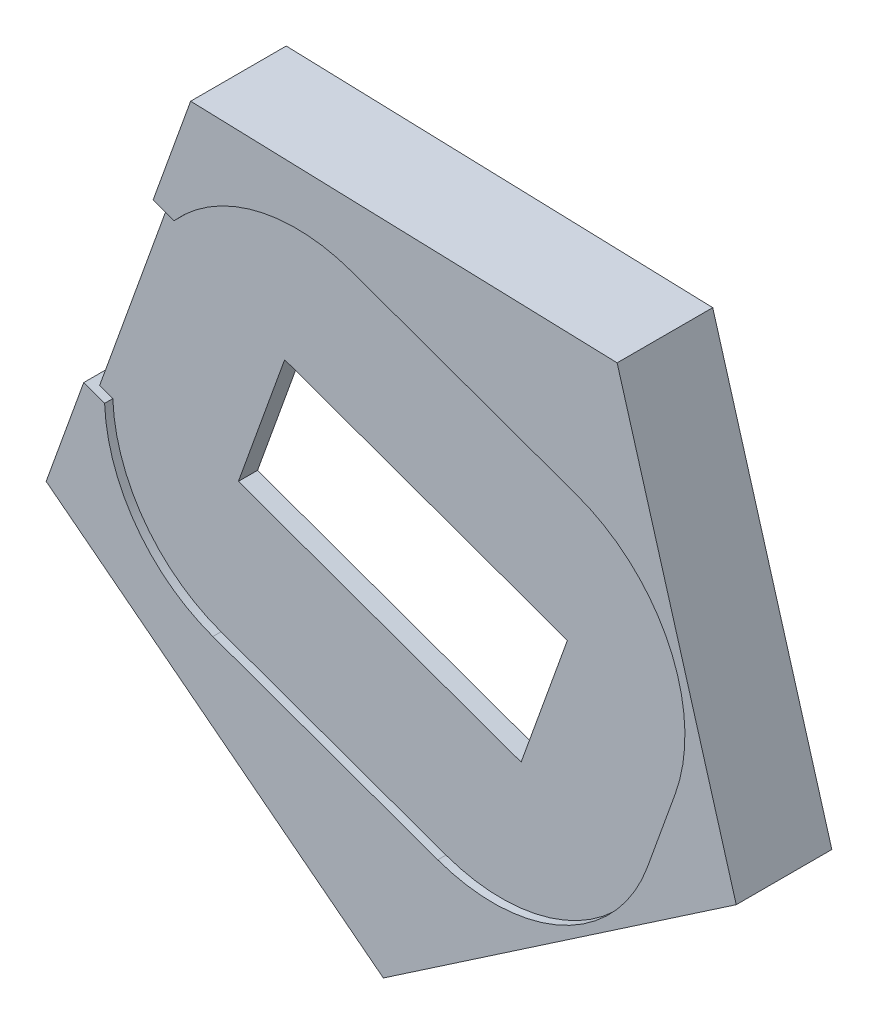
ISO-10303-21;
HEADER;
FILE_DESCRIPTION(('STEP AP214'),'2;1');
FILE_NAME('part.step','',(''),(''),'','','');
FILE_SCHEMA(('AUTOMOTIVE_DESIGN { 1 0 10303 214 1 1 1 1 }'));
ENDSEC;
DATA;
#1=APPLICATION_CONTEXT('core data for automotive mechanical design processes');
#2=APPLICATION_PROTOCOL_DEFINITION('international standard','automotive_design',2000,#1);
#3=PRODUCT_CONTEXT('',#1,'mechanical');
#4=PRODUCT('Part','Part','',(#3));
#5=PRODUCT_RELATED_PRODUCT_CATEGORY('part','',(#4));
#6=PRODUCT_DEFINITION_FORMATION('','',#4);
#7=PRODUCT_DEFINITION_CONTEXT('part definition',#1,'design');
#8=PRODUCT_DEFINITION('design','',#6,#7);
#9=PRODUCT_DEFINITION_SHAPE('','',#8);
#10=(LENGTH_UNIT() NAMED_UNIT(*) SI_UNIT(.MILLI.,.METRE.));
#11=(NAMED_UNIT(*) PLANE_ANGLE_UNIT() SI_UNIT($,.RADIAN.));
#12=(NAMED_UNIT(*) SI_UNIT($,.STERADIAN.) SOLID_ANGLE_UNIT());
#13=UNCERTAINTY_MEASURE_WITH_UNIT(LENGTH_MEASURE(1.E-05),#10,'distance_accuracy_value','');
#14=(GEOMETRIC_REPRESENTATION_CONTEXT(3) GLOBAL_UNCERTAINTY_ASSIGNED_CONTEXT((#13)) GLOBAL_UNIT_ASSIGNED_CONTEXT((#10,
#11,#12)) REPRESENTATION_CONTEXT('',''));
#15=CARTESIAN_POINT('',(0.,0.,0.));
#16=DIRECTION('',(0.,0.,1.));
#17=DIRECTION('',(1.,0.,0.));
#18=AXIS2_PLACEMENT_3D('',#15,#16,#17);
#19=CARTESIAN_POINT('',(-2.74839514951488,-23.1773097943173,180.));
#20=DIRECTION('',(0.,0.,-1.));
#21=DIRECTION('',(-1.,0.,0.));
#22=AXIS2_PLACEMENT_3D('',#19,#20,#21);
#23=PLANE('',#22);
#24=DIRECTION('',(0.826995464471339,0.562208592733902,0.));
#25=VECTOR('',#24,1.);
#26=CARTESIAN_POINT('',(21.1936307016192,-9.77606172663702,180.));
#27=LINE('',#26,#25);
#28=CARTESIAN_POINT('',(-0.772775653441571,-24.7092783340513,180.));
#29=VERTEX_POINT('',#28);
#30=CARTESIAN_POINT('',(23.2611193627975,-8.3705402448024,180.));
#31=VERTEX_POINT('',#30);
#32=EDGE_CURVE('E285',#29,#31,#27,.T.);
#33=ORIENTED_EDGE('',*,*,#32,.T.);
#34=DIRECTION('',(-0.279136492844062,0.960251434970403,0.));
#35=VECTOR('',#34,1.);
#36=CARTESIAN_POINT('',(15.8467792681287,17.1353713711387,180.));
#37=LINE('',#36,#35);
#38=CARTESIAN_POINT('',(15.1489380360187,19.5359999585645,180.));
#39=VERTEX_POINT('',#38);
#40=EDGE_CURVE('E291',#31,#39,#37,.T.);
#41=ORIENTED_EDGE('',*,*,#40,.T.);
#42=DIRECTION('',(-0.999511304549409,0.0312594318236611,0.));
#43=VECTOR('',#42,1.);
#44=CARTESIAN_POINT('',(-11.3997825016985,20.3663036438525,180.));
#45=LINE('',#44,#43);
#46=CARTESIAN_POINT('',(-13.8985607630718,20.4444522234118,180.));
#47=VERTEX_POINT('',#46);
#48=EDGE_CURVE('E236',#39,#47,#45,.T.);
#49=ORIENTED_EDGE('',*,*,#48,.T.);
#50=DIRECTION('',(-0.338595465507229,-0.940932043634365,0.));
#51=VECTOR('',#50,1.);
#52=CARTESIAN_POINT('',(-22.8922323185347,-4.54830349403677,180.));
#53=LINE('',#52,#51);
#54=CARTESIAN_POINT('',(-23.7387209823028,-6.90063360312268,180.));
#55=VERTEX_POINT('',#54);
#56=EDGE_CURVE('E226',#47,#55,#53,.T.);
#57=ORIENTED_EDGE('',*,*,#56,.T.);
#58=DIRECTION('',(0.790247798429351,-0.612787415893607,0.));
#59=VECTOR('',#58,1.);
#60=CARTESIAN_POINT('',(-2.74839514951489,-23.1773097943173,180.));
#61=LINE('',#60,#59);
#62=EDGE_CURVE('E225',#55,#29,#61,.T.);
#63=ORIENTED_EDGE('',*,*,#62,.T.);
#64=EDGE_LOOP('',(#33,#41,#49,#57,#63));
#65=FACE_BOUND('',#64,.T.);
#66=DIRECTION('',(0.279136492844062,-0.960251434970402,0.));
#67=VECTOR('',#66,1.);
#68=CARTESIAN_POINT('',(17.2871564205843,17.5540761104048,180.));
#69=LINE('',#68,#67);
#70=CARTESIAN_POINT('',(16.2851083887201,21.0011999554569,180.));
#71=VERTEX_POINT('',#70);
#72=CARTESIAN_POINT('',(25.0057033150073,-8.99833076316258,180.));
#73=VERTEX_POINT('',#72);
#74=EDGE_CURVE('E289',#71,#73,#69,.T.);
#75=ORIENTED_EDGE('',*,*,#74,.T.);
#76=DIRECTION('',(-0.826995464471339,-0.562208592733902,0.));
#77=VECTOR('',#76,1.);
#78=CARTESIAN_POINT('',(22.03694359072,-11.016554923344,180.));
#79=LINE('',#78,#77);
#80=CARTESIAN_POINT('',(-0.830733827449708,-26.5624742091051,180.));
#81=VERTEX_POINT('',#80);
#82=EDGE_CURVE('E294',#73,#81,#79,.T.);
#83=ORIENTED_EDGE('',*,*,#82,.T.);
#84=DIRECTION('',(-0.790247798429351,0.612787415893607,0.));
#85=VECTOR('',#84,1.);
#86=CARTESIAN_POINT('',(-3.6675762733553,-24.3626814919613,180.));
#87=LINE('',#86,#85);
#88=CARTESIAN_POINT('',(-25.5191250559755,-7.41818112335687,180.));
#89=VERTEX_POINT('',#88);
#90=EDGE_CURVE('E220',#81,#89,#87,.T.);
#91=ORIENTED_EDGE('',*,*,#90,.T.);
#92=DIRECTION('',(0.338595465507229,0.940932043634365,0.));
#93=VECTOR('',#92,1.);
#94=CARTESIAN_POINT('',(-24.3036303839863,-4.04041029577592,180.));
#95=LINE('',#94,#93);
#96=CARTESIAN_POINT('',(-14.9409528203022,21.9777861401677,180.));
#97=VERTEX_POINT('',#96);
#98=EDGE_CURVE('E215',#89,#97,#95,.T.);
#99=ORIENTED_EDGE('',*,*,#98,.T.);
#100=DIRECTION('',(0.999511304549409,-0.0312594318236609,0.));
#101=VECTOR('',#100,1.);
#102=CARTESIAN_POINT('',(-11.3528933539631,21.8655706006766,180.));
#103=LINE('',#102,#101);
#104=EDGE_CURVE('E217',#97,#71,#103,.T.);
#105=ORIENTED_EDGE('',*,*,#104,.T.);
#106=EDGE_LOOP('',(#75,#83,#91,#99,#105));
#107=FACE_BOUND('',#106,.T.);
#108=ADVANCED_FACE('F33',(#65,#107),#23,.T.);
#109=CARTESIAN_POINT('',(7.21736898527902,-5.78550645409135,186.4));
#110=DIRECTION('',(0.,0.,-1.));
#111=DIRECTION('',(-1.,0.,0.));
#112=AXIS2_PLACEMENT_3D('',#109,#110,#111);
#113=PLANE('',#112);
#114=DIRECTION('',(-0.940932043634384,0.338595465507176,0.));
#115=VECTOR('',#114,1.);
#116=CARTESIAN_POINT('',(-17.6905729468346,14.3367928356631,186.4));
#117=LINE('',#116,#115);
#118=CARTESIAN_POINT('',(-16.160897588188,13.7863374189943,186.4));
#119=VERTEX_POINT('',#118);
#120=CARTESIAN_POINT('',(-17.126013720654,14.1336355563588,186.4));
#121=VERTEX_POINT('',#120);
#122=EDGE_CURVE('E401',#119,#121,#117,.T.);
#123=ORIENTED_EDGE('',*,*,#122,.T.);
#124=DIRECTION('',(0.338595465507229,0.940932043634365,0.));
#125=VECTOR('',#124,1.);
#126=CARTESIAN_POINT('',(-17.126013720654,14.1336355563588,186.4));
#127=LINE('',#126,#125);
#128=CARTESIAN_POINT('',(-22.2049457032625,0.0196549018433466,186.4));
#129=VERTEX_POINT('',#128);
#130=EDGE_CURVE('E52',#129,#121,#127,.T.);
#131=ORIENTED_EDGE('',*,*,#130,.F.);
#132=DIRECTION('',(0.940932043634383,-0.338595465507181,0.));
#133=VECTOR('',#132,1.);
#134=CARTESIAN_POINT('',(-22.7695049294431,0.222812181147685,186.4));
#135=LINE('',#134,#133);
#136=CARTESIAN_POINT('',(-21.2398295707964,-0.327643235521149,186.4));
#137=VERTEX_POINT('',#136);
#138=EDGE_CURVE('E398',#129,#137,#135,.T.);
#139=ORIENTED_EDGE('',*,*,#138,.T.);
#140=CARTESIAN_POINT('',(-9.24894177832239,0.139914192285155,186.4));
#141=DIRECTION('',(0.,0.,1.));
#142=DIRECTION('',(-1.,0.,0.));
#143=AXIS2_PLACEMENT_3D('',#140,#141,#142);
#144=CIRCLE('',#143,12.);
#145=CARTESIAN_POINT('',(-13.3120873644091,-11.1512703313272,186.4));
#146=VERTEX_POINT('',#145);
#147=EDGE_CURVE('E348',#137,#146,#144,.T.);
#148=ORIENTED_EDGE('',*,*,#147,.T.);
#149=DIRECTION('',(0.940932043634365,-0.338595465507229,0.));
#150=VECTOR('',#149,1.);
#151=CARTESIAN_POINT('',(3.15422339919227,-17.0766909777037,186.4));
#152=LINE('',#151,#150);
#153=CARTESIAN_POINT('',(3.15422339919227,-17.0766909777037,186.4));
#154=VERTEX_POINT('',#153);
#155=EDGE_CURVE('E313',#146,#154,#152,.T.);
#156=ORIENTED_EDGE('',*,*,#155,.T.);
#157=CARTESIAN_POINT('',(7.21736898527902,-5.78550645409135,186.4));
#158=DIRECTION('',(0.,0.,1.));
#159=DIRECTION('',(-1.,0.,0.));
#160=AXIS2_PLACEMENT_3D('',#157,#158,#159);
#161=CIRCLE('',#160,12.);
#162=CARTESIAN_POINT('',(18.5085535088914,-9.8486520401781,186.4));
#163=VERTEX_POINT('',#162);
#164=EDGE_CURVE('E329',#154,#163,#161,.T.);
#165=ORIENTED_EDGE('',*,*,#164,.T.);
#166=DIRECTION('',(0.338595465507229,0.940932043634365,0.));
#167=VECTOR('',#166,1.);
#168=CARTESIAN_POINT('',(18.5085535088914,-9.8486520401781,186.4));
#169=LINE('',#168,#167);
#170=CARTESIAN_POINT('',(20.5401263019348,-4.20305977837191,186.4));
#171=VERTEX_POINT('',#170);
#172=EDGE_CURVE('E359',#163,#171,#169,.T.);
#173=ORIENTED_EDGE('',*,*,#172,.T.);
#174=CARTESIAN_POINT('',(9.24894177832239,-0.13991419228516,186.4));
#175=DIRECTION('',(0.,0.,1.));
#176=DIRECTION('',(1.,0.,0.));
#177=AXIS2_PLACEMENT_3D('',#174,#175,#176);
#178=CIRCLE('',#177,12.);
#179=CARTESIAN_POINT('',(13.3120873644091,11.1512703313272,186.4));
#180=VERTEX_POINT('',#179);
#181=EDGE_CURVE('E356',#171,#180,#178,.T.);
#182=ORIENTED_EDGE('',*,*,#181,.T.);
#183=DIRECTION('',(-0.940932043634365,0.338595465507229,0.));
#184=VECTOR('',#183,1.);
#185=CARTESIAN_POINT('',(13.3120873644091,11.1512703313272,186.4));
#186=LINE('',#185,#184);
#187=CARTESIAN_POINT('',(-3.15422339919227,17.0766909777037,186.4));
#188=VERTEX_POINT('',#187);
#189=EDGE_CURVE('E353',#180,#188,#186,.T.);
#190=ORIENTED_EDGE('',*,*,#189,.T.);
#191=CARTESIAN_POINT('',(-7.21736898527902,5.78550645409135,186.4));
#192=DIRECTION('',(0.,0.,1.));
#193=DIRECTION('',(-1.,0.,0.));
#194=AXIS2_PLACEMENT_3D('',#191,#192,#193);
#195=CIRCLE('',#194,12.);
#196=EDGE_CURVE('E350',#188,#119,#195,.T.);
#197=ORIENTED_EDGE('',*,*,#196,.T.);
#198=EDGE_LOOP('',(#123,#131,#139,#148,#156,#165,#173,#182,#190,#197));
#199=FACE_BOUND('',#198,.T.);
#200=DIRECTION('',(-0.940932043634366,0.338595465507228,0.));
#201=VECTOR('',#200,1.);
#202=CARTESIAN_POINT('',(12.0432298075142,0.980110097592314,186.4));
#203=LINE('',#202,#201);
#204=CARTESIAN_POINT('',(12.0432298075142,0.980110097592314,186.4));
#205=VERTEX_POINT('',#204);
#206=CARTESIAN_POINT('',(-8.65727515244189,8.42921033875132,186.4));
#207=VERTEX_POINT('',#206);
#208=EDGE_CURVE('E384',#205,#207,#203,.T.);
#209=ORIENTED_EDGE('',*,*,#208,.F.);
#210=DIRECTION('',(0.338595465507229,0.940932043634365,0.));
#211=VECTOR('',#210,1.);
#212=CARTESIAN_POINT('',(12.0432298075142,0.980110097592314,186.4));
#213=LINE('',#212,#211);
#214=CARTESIAN_POINT('',(8.65727515244187,-8.42921033875134,186.4));
#215=VERTEX_POINT('',#214);
#216=EDGE_CURVE('E368',#215,#205,#213,.T.);
#217=ORIENTED_EDGE('',*,*,#216,.F.);
#218=DIRECTION('',(0.940932043634365,-0.33859546550723,0.));
#219=VECTOR('',#218,1.);
#220=CARTESIAN_POINT('',(8.65727515244187,-8.42921033875134,186.4));
#221=LINE('',#220,#219);
#222=CARTESIAN_POINT('',(-12.0432298075142,-0.980110097592288,186.4));
#223=VERTEX_POINT('',#222);
#224=EDGE_CURVE('E379',#223,#215,#221,.T.);
#225=ORIENTED_EDGE('',*,*,#224,.F.);
#226=DIRECTION('',(-0.338595465507229,-0.940932043634365,0.));
#227=VECTOR('',#226,1.);
#228=CARTESIAN_POINT('',(-8.65727515244189,8.42921033875132,186.4));
#229=LINE('',#228,#227);
#230=EDGE_CURVE('E381',#207,#223,#229,.T.);
#231=ORIENTED_EDGE('',*,*,#230,.F.);
#232=EDGE_LOOP('',(#209,#217,#225,#231));
#233=FACE_BOUND('',#232,.T.);
#234=ADVANCED_FACE('F499',(#199,#233),#113,.F.);
#235=CARTESIAN_POINT('',(12.0432298075142,0.980110097592314,155.599933936706));
#236=DIRECTION('',(0.940932043634365,-0.338595465507229,0.));
#237=DIRECTION('',(0.338595465507229,0.940932043634365,0.));
#238=AXIS2_PLACEMENT_3D('',#235,#236,#237);
#239=PLANE('',#238);
#240=DIRECTION('',(-0.338595465507229,-0.940932043634365,0.));
#241=VECTOR('',#240,1.);
#242=CARTESIAN_POINT('',(12.0432298075142,0.980110097592314,185.));
#243=LINE('',#242,#241);
#244=CARTESIAN_POINT('',(12.0432298075142,0.980110097592314,185.));
#245=VERTEX_POINT('',#244);
#246=CARTESIAN_POINT('',(8.65727515244187,-8.42921033875134,185.));
#247=VERTEX_POINT('',#246);
#248=EDGE_CURVE('E389',#245,#247,#243,.T.);
#249=ORIENTED_EDGE('',*,*,#248,.T.);
#250=DIRECTION('',(0.,0.,1.));
#251=VECTOR('',#250,1.);
#252=CARTESIAN_POINT('',(8.65727515244187,-8.42921033875134,155.599933936706));
#253=LINE('',#252,#251);
#254=EDGE_CURVE('E371',#247,#215,#253,.T.);
#255=ORIENTED_EDGE('',*,*,#254,.T.);
#256=ORIENTED_EDGE('',*,*,#216,.T.);
#257=DIRECTION('',(0.,0.,1.));
#258=VECTOR('',#257,1.);
#259=CARTESIAN_POINT('',(12.0432298075142,0.980110097592314,155.599933936706));
#260=LINE('',#259,#258);
#261=EDGE_CURVE('E374',#245,#205,#260,.T.);
#262=ORIENTED_EDGE('',*,*,#261,.F.);
#263=EDGE_LOOP('',(#249,#255,#256,#262));
#264=FACE_BOUND('',#263,.T.);
#265=ADVANCED_FACE('F526',(#264),#239,.F.);
#266=CARTESIAN_POINT('',(8.65727515244187,-8.42921033875134,155.599933936706));
#267=DIRECTION('',(-0.33859546550723,-0.940932043634365,0.));
#268=DIRECTION('',(0.940932043634365,-0.33859546550723,0.));
#269=AXIS2_PLACEMENT_3D('',#266,#267,#268);
#270=PLANE('',#269);
#271=DIRECTION('',(-0.940932043634365,0.33859546550723,0.));
#272=VECTOR('',#271,1.);
#273=CARTESIAN_POINT('',(8.65727515244187,-8.42921033875134,185.));
#274=LINE('',#273,#272);
#275=CARTESIAN_POINT('',(-12.0432298075142,-0.980110097592288,185.));
#276=VERTEX_POINT('',#275);
#277=EDGE_CURVE('E376',#247,#276,#274,.T.);
#278=ORIENTED_EDGE('',*,*,#277,.T.);
#279=DIRECTION('',(0.,0.,1.));
#280=VECTOR('',#279,1.);
#281=CARTESIAN_POINT('',(-12.0432298075142,-0.980110097592288,155.599933936706));
#282=LINE('',#281,#280);
#283=EDGE_CURVE('E369',#276,#223,#282,.T.);
#284=ORIENTED_EDGE('',*,*,#283,.T.);
#285=ORIENTED_EDGE('',*,*,#224,.T.);
#286=ORIENTED_EDGE('',*,*,#254,.F.);
#287=EDGE_LOOP('',(#278,#284,#285,#286));
#288=FACE_BOUND('',#287,.T.);
#289=ADVANCED_FACE('F577',(#288),#270,.F.);
#290=CARTESIAN_POINT('',(-8.65727515244189,8.42921033875132,155.599933936706));
#291=DIRECTION('',(-0.940932043634365,0.338595465507229,0.));
#292=DIRECTION('',(-0.338595465507229,-0.940932043634365,0.));
#293=AXIS2_PLACEMENT_3D('',#290,#291,#292);
#294=PLANE('',#293);
#295=DIRECTION('',(0.338595465507229,0.940932043634365,0.));
#296=VECTOR('',#295,1.);
#297=CARTESIAN_POINT('',(-8.65727515244189,8.42921033875132,185.));
#298=LINE('',#297,#296);
#299=CARTESIAN_POINT('',(-8.65727515244189,8.42921033875132,185.));
#300=VERTEX_POINT('',#299);
#301=EDGE_CURVE('E345',#276,#300,#298,.T.);
#302=ORIENTED_EDGE('',*,*,#301,.T.);
#303=DIRECTION('',(0.,0.,1.));
#304=VECTOR('',#303,1.);
#305=CARTESIAN_POINT('',(-8.65727515244189,8.42921033875132,155.599933936706));
#306=LINE('',#305,#304);
#307=EDGE_CURVE('E366',#300,#207,#306,.T.);
#308=ORIENTED_EDGE('',*,*,#307,.T.);
#309=ORIENTED_EDGE('',*,*,#230,.T.);
#310=ORIENTED_EDGE('',*,*,#283,.F.);
#311=EDGE_LOOP('',(#302,#308,#309,#310));
#312=FACE_BOUND('',#311,.T.);
#313=ADVANCED_FACE('F571',(#312),#294,.F.);
#314=CARTESIAN_POINT('',(12.0432298075142,0.980110097592314,155.599933936706));
#315=DIRECTION('',(0.338595465507228,0.940932043634366,0.));
#316=DIRECTION('',(-0.940932043634366,0.338595465507228,0.));
#317=AXIS2_PLACEMENT_3D('',#314,#315,#316);
#318=PLANE('',#317);
#319=DIRECTION('',(0.940932043634366,-0.338595465507228,0.));
#320=VECTOR('',#319,1.);
#321=CARTESIAN_POINT('',(12.0432298075142,0.980110097592314,185.));
#322=LINE('',#321,#320);
#323=EDGE_CURVE('E365',#300,#245,#322,.T.);
#324=ORIENTED_EDGE('',*,*,#323,.T.);
#325=ORIENTED_EDGE('',*,*,#261,.T.);
#326=ORIENTED_EDGE('',*,*,#208,.T.);
#327=ORIENTED_EDGE('',*,*,#307,.F.);
#328=EDGE_LOOP('',(#324,#325,#326,#327));
#329=FACE_BOUND('',#328,.T.);
#330=ADVANCED_FACE('F565',(#329),#318,.F.);
#331=CARTESIAN_POINT('',(-19.6654797119583,7.07664522910109,0.));
#332=DIRECTION('',(0.940932043634365,-0.338595465507229,0.));
#333=DIRECTION('',(0.338595465507229,0.940932043634365,0.));
#334=AXIS2_PLACEMENT_3D('',#331,#332,#333);
#335=PLANE('',#334);
#336=DIRECTION('',(-0.338595465507229,-0.940932043634365,0.));
#337=VECTOR('',#336,1.);
#338=CARTESIAN_POINT('',(-22.2049457032625,0.0196549018433397,185.));
#339=LINE('',#338,#337);
#340=CARTESIAN_POINT('',(-17.126013720654,14.1336355563588,185.));
#341=VERTEX_POINT('',#340);
#342=CARTESIAN_POINT('',(-22.2049457032625,0.0196549018433405,185.));
#343=VERTEX_POINT('',#342);
#344=EDGE_CURVE('E11',#341,#343,#339,.T.);
#345=ORIENTED_EDGE('',*,*,#344,.T.);
#346=DIRECTION('',(0.,0.,1.));
#347=VECTOR('',#346,1.);
#348=CARTESIAN_POINT('',(-22.2049457032625,0.0196549018433397,185.));
#349=LINE('',#348,#347);
#350=EDGE_CURVE('E42',#343,#129,#349,.T.);
#351=ORIENTED_EDGE('',*,*,#350,.T.);
#352=ORIENTED_EDGE('',*,*,#130,.T.);
#353=DIRECTION('',(0.,0.,-1.));
#354=VECTOR('',#353,1.);
#355=CARTESIAN_POINT('',(-17.126013720654,14.1336355563588,185.));
#356=LINE('',#355,#354);
#357=EDGE_CURVE('E428',#121,#341,#356,.T.);
#358=ORIENTED_EDGE('',*,*,#357,.T.);
#359=EDGE_LOOP('',(#345,#351,#352,#358));
#360=FACE_BOUND('',#359,.T.);
#361=ADVANCED_FACE('F502',(#360),#335,.F.);
#362=CARTESIAN_POINT('',(-9.24894177832239,0.139914192285155,186.4));
#363=DIRECTION('',(0.,0.,1.));
#364=DIRECTION('',(1.,0.,0.));
#365=AXIS2_PLACEMENT_3D('',#362,#363,#364);
#366=CYLINDRICAL_SURFACE('',#365,12.);
#367=ORIENTED_EDGE('',*,*,#147,.F.);
#368=DIRECTION('',(0.,0.,1.));
#369=VECTOR('',#368,1.);
#370=CARTESIAN_POINT('',(-21.2398295707964,-0.327643235521149,170.315243978327));
#371=LINE('',#370,#369);
#372=CARTESIAN_POINT('',(-21.2398295707964,-0.327643235521149,187.));
#373=VERTEX_POINT('',#372);
#374=EDGE_CURVE('E395',#137,#373,#371,.T.);
#375=ORIENTED_EDGE('',*,*,#374,.T.);
#376=CARTESIAN_POINT('',(-9.24894177832239,0.139914192285155,187.));
#377=DIRECTION('',(0.,0.,1.));
#378=DIRECTION('',(-1.,0.,0.));
#379=AXIS2_PLACEMENT_3D('',#376,#377,#378);
#380=CIRCLE('',#379,12.);
#381=CARTESIAN_POINT('',(-13.3120873644091,-11.1512703313272,187.));
#382=VERTEX_POINT('',#381);
#383=EDGE_CURVE('E328',#373,#382,#380,.T.);
#384=ORIENTED_EDGE('',*,*,#383,.T.);
#385=DIRECTION('',(0.,0.,1.));
#386=VECTOR('',#385,1.);
#387=CARTESIAN_POINT('',(-13.3120873644091,-11.1512703313272,186.4));
#388=LINE('',#387,#386);
#389=EDGE_CURVE('E320',#146,#382,#388,.T.);
#390=ORIENTED_EDGE('',*,*,#389,.F.);
#391=EDGE_LOOP('',(#367,#375,#384,#390));
#392=FACE_BOUND('',#391,.T.);
#393=ADVANCED_FACE('F494',(#392),#366,.F.);
#394=CARTESIAN_POINT('',(3.15422339919227,-17.0766909777037,186.4));
#395=DIRECTION('',(-0.338595465507229,-0.940932043634365,0.));
#396=DIRECTION('',(0.940932043634365,-0.338595465507229,0.));
#397=AXIS2_PLACEMENT_3D('',#394,#395,#396);
#398=PLANE('',#397);
#399=DIRECTION('',(0.940932043634365,-0.338595465507229,0.));
#400=VECTOR('',#399,1.);
#401=CARTESIAN_POINT('',(3.15422339919227,-17.0766909777037,187.));
#402=LINE('',#401,#400);
#403=CARTESIAN_POINT('',(3.15422339919227,-17.0766909777037,187.));
#404=VERTEX_POINT('',#403);
#405=EDGE_CURVE('E325',#382,#404,#402,.T.);
#406=ORIENTED_EDGE('',*,*,#405,.T.);
#407=DIRECTION('',(0.,0.,1.));
#408=VECTOR('',#407,1.);
#409=CARTESIAN_POINT('',(3.15422339919227,-17.0766909777037,186.4));
#410=LINE('',#409,#408);
#411=EDGE_CURVE('E323',#154,#404,#410,.T.);
#412=ORIENTED_EDGE('',*,*,#411,.F.);
#413=ORIENTED_EDGE('',*,*,#155,.F.);
#414=ORIENTED_EDGE('',*,*,#389,.T.);
#415=EDGE_LOOP('',(#406,#412,#413,#414));
#416=FACE_BOUND('',#415,.T.);
#417=ADVANCED_FACE('F489',(#416),#398,.F.);
#418=CARTESIAN_POINT('',(7.21736898527902,-5.78550645409135,186.4));
#419=DIRECTION('',(0.,0.,1.));
#420=DIRECTION('',(1.,0.,0.));
#421=AXIS2_PLACEMENT_3D('',#418,#419,#420);
#422=CYLINDRICAL_SURFACE('',#421,12.);
#423=CARTESIAN_POINT('',(7.21736898527902,-5.78550645409135,187.));
#424=DIRECTION('',(0.,0.,1.));
#425=DIRECTION('',(-1.,0.,0.));
#426=AXIS2_PLACEMENT_3D('',#423,#424,#425);
#427=CIRCLE('',#426,12.);
#428=CARTESIAN_POINT('',(18.5085535088914,-9.8486520401781,187.));
#429=VERTEX_POINT('',#428);
#430=EDGE_CURVE('E343',#404,#429,#427,.T.);
#431=ORIENTED_EDGE('',*,*,#430,.T.);
#432=DIRECTION('',(0.,0.,1.));
#433=VECTOR('',#432,1.);
#434=CARTESIAN_POINT('',(18.5085535088914,-9.8486520401781,186.4));
#435=LINE('',#434,#433);
#436=EDGE_CURVE('E310',#163,#429,#435,.T.);
#437=ORIENTED_EDGE('',*,*,#436,.F.);
#438=ORIENTED_EDGE('',*,*,#164,.F.);
#439=ORIENTED_EDGE('',*,*,#411,.T.);
#440=EDGE_LOOP('',(#431,#437,#438,#439));
#441=FACE_BOUND('',#440,.T.);
#442=ADVANCED_FACE('F485',(#441),#422,.F.);
#443=CARTESIAN_POINT('',(18.5085535088914,-9.8486520401781,186.4));
#444=DIRECTION('',(0.940932043634365,-0.338595465507229,0.));
#445=DIRECTION('',(0.338595465507229,0.940932043634365,0.));
#446=AXIS2_PLACEMENT_3D('',#443,#444,#445);
#447=PLANE('',#446);
#448=DIRECTION('',(0.338595465507229,0.940932043634365,0.));
#449=VECTOR('',#448,1.);
#450=CARTESIAN_POINT('',(18.5085535088914,-9.8486520401781,187.));
#451=LINE('',#450,#449);
#452=CARTESIAN_POINT('',(20.5401263019348,-4.20305977837191,187.));
#453=VERTEX_POINT('',#452);
#454=EDGE_CURVE('E340',#429,#453,#451,.T.);
#455=ORIENTED_EDGE('',*,*,#454,.T.);
#456=DIRECTION('',(0.,0.,1.));
#457=VECTOR('',#456,1.);
#458=CARTESIAN_POINT('',(20.5401263019348,-4.20305977837191,186.4));
#459=LINE('',#458,#457);
#460=EDGE_CURVE('E314',#171,#453,#459,.T.);
#461=ORIENTED_EDGE('',*,*,#460,.F.);
#462=ORIENTED_EDGE('',*,*,#172,.F.);
#463=ORIENTED_EDGE('',*,*,#436,.T.);
#464=EDGE_LOOP('',(#455,#461,#462,#463));
#465=FACE_BOUND('',#464,.T.);
#466=ADVANCED_FACE('F482',(#465),#447,.F.);
#467=CARTESIAN_POINT('',(9.24894177832239,-0.13991419228516,186.4));
#468=DIRECTION('',(0.,0.,1.));
#469=DIRECTION('',(1.,0.,0.));
#470=AXIS2_PLACEMENT_3D('',#467,#468,#469);
#471=CYLINDRICAL_SURFACE('',#470,12.);
#472=CARTESIAN_POINT('',(9.24894177832239,-0.13991419228516,187.));
#473=DIRECTION('',(0.,0.,1.));
#474=DIRECTION('',(1.,0.,0.));
#475=AXIS2_PLACEMENT_3D('',#472,#473,#474);
#476=CIRCLE('',#475,12.);
#477=CARTESIAN_POINT('',(13.3120873644091,11.1512703313272,187.));
#478=VERTEX_POINT('',#477);
#479=EDGE_CURVE('E337',#453,#478,#476,.T.);
#480=ORIENTED_EDGE('',*,*,#479,.T.);
#481=DIRECTION('',(0.,0.,1.));
#482=VECTOR('',#481,1.);
#483=CARTESIAN_POINT('',(13.3120873644091,11.1512703313272,186.4));
#484=LINE('',#483,#482);
#485=EDGE_CURVE('E316',#180,#478,#484,.T.);
#486=ORIENTED_EDGE('',*,*,#485,.F.);
#487=ORIENTED_EDGE('',*,*,#181,.F.);
#488=ORIENTED_EDGE('',*,*,#460,.T.);
#489=EDGE_LOOP('',(#480,#486,#487,#488));
#490=FACE_BOUND('',#489,.T.);
#491=ADVANCED_FACE('F478',(#490),#471,.F.);
#492=CARTESIAN_POINT('',(13.3120873644091,11.1512703313272,186.4));
#493=DIRECTION('',(0.338595465507229,0.940932043634365,0.));
#494=DIRECTION('',(-0.940932043634365,0.338595465507229,0.));
#495=AXIS2_PLACEMENT_3D('',#492,#493,#494);
#496=PLANE('',#495);
#497=DIRECTION('',(-0.940932043634365,0.338595465507229,0.));
#498=VECTOR('',#497,1.);
#499=CARTESIAN_POINT('',(13.3120873644091,11.1512703313272,187.));
#500=LINE('',#499,#498);
#501=CARTESIAN_POINT('',(-3.15422339919227,17.0766909777037,187.));
#502=VERTEX_POINT('',#501);
#503=EDGE_CURVE('E334',#478,#502,#500,.T.);
#504=ORIENTED_EDGE('',*,*,#503,.T.);
#505=DIRECTION('',(0.,0.,1.));
#506=VECTOR('',#505,1.);
#507=CARTESIAN_POINT('',(-3.15422339919227,17.0766909777037,186.4));
#508=LINE('',#507,#506);
#509=EDGE_CURVE('E318',#188,#502,#508,.T.);
#510=ORIENTED_EDGE('',*,*,#509,.F.);
#511=ORIENTED_EDGE('',*,*,#189,.F.);
#512=ORIENTED_EDGE('',*,*,#485,.T.);
#513=EDGE_LOOP('',(#504,#510,#511,#512));
#514=FACE_BOUND('',#513,.T.);
#515=ADVANCED_FACE('F473',(#514),#496,.F.);
#516=CARTESIAN_POINT('',(-7.21736898527902,5.78550645409135,186.4));
#517=DIRECTION('',(0.,0.,1.));
#518=DIRECTION('',(1.,0.,0.));
#519=AXIS2_PLACEMENT_3D('',#516,#517,#518);
#520=CYLINDRICAL_SURFACE('',#519,12.);
#521=CARTESIAN_POINT('',(-7.21736898527902,5.78550645409135,187.));
#522=DIRECTION('',(0.,0.,1.));
#523=DIRECTION('',(-1.,0.,0.));
#524=AXIS2_PLACEMENT_3D('',#521,#522,#523);
#525=CIRCLE('',#524,12.);
#526=CARTESIAN_POINT('',(-16.160897588188,13.7863374189943,187.));
#527=VERTEX_POINT('',#526);
#528=EDGE_CURVE('E331',#502,#527,#525,.T.);
#529=ORIENTED_EDGE('',*,*,#528,.T.);
#530=DIRECTION('',(0.,0.,1.));
#531=VECTOR('',#530,1.);
#532=CARTESIAN_POINT('',(-16.160897588188,13.7863374189943,170.315243978327));
#533=LINE('',#532,#531);
#534=EDGE_CURVE('E399',#119,#527,#533,.T.);
#535=ORIENTED_EDGE('',*,*,#534,.F.);
#536=ORIENTED_EDGE('',*,*,#196,.F.);
#537=ORIENTED_EDGE('',*,*,#509,.T.);
#538=EDGE_LOOP('',(#529,#535,#536,#537));
#539=FACE_BOUND('',#538,.T.);
#540=ADVANCED_FACE('F469',(#539),#520,.F.);
#541=CARTESIAN_POINT('',(-17.6905729468346,14.3367928356631,170.315243978327));
#542=DIRECTION('',(0.338595465507176,0.940932043634384,0.));
#543=DIRECTION('',(-0.940932043634384,0.338595465507176,0.));
#544=AXIS2_PLACEMENT_3D('',#541,#542,#543);
#545=PLANE('',#544);
#546=ORIENTED_EDGE('',*,*,#534,.T.);
#547=DIRECTION('',(-0.940932043634384,0.338595465507176,0.));
#548=VECTOR('',#547,1.);
#549=CARTESIAN_POINT('',(-17.6905729468346,14.3367928356631,187.));
#550=LINE('',#549,#548);
#551=CARTESIAN_POINT('',(-17.6905729468346,14.3367928356631,187.));
#552=VERTEX_POINT('',#551);
#553=EDGE_CURVE('E406',#527,#552,#550,.T.);
#554=ORIENTED_EDGE('',*,*,#553,.T.);
#555=DIRECTION('',(0.,0.,1.));
#556=VECTOR('',#555,1.);
#557=CARTESIAN_POINT('',(-17.6905729468346,14.3367928356631,170.315243978327));
#558=LINE('',#557,#556);
#559=CARTESIAN_POINT('',(-17.6905729468346,14.3367928356632,183.5));
#560=VERTEX_POINT('',#559);
#561=EDGE_CURVE('E394',#560,#552,#558,.T.);
#562=ORIENTED_EDGE('',*,*,#561,.F.);
#563=DIRECTION('',(0.940932043634365,-0.338595465507229,0.));
#564=VECTOR('',#563,1.);
#565=CARTESIAN_POINT('',(-31.8749479565133,19.4410563069979,183.5));
#566=LINE('',#565,#564);
#567=CARTESIAN_POINT('',(-16.2791748813831,13.8288996374023,183.5));
#568=VERTEX_POINT('',#567);
#569=EDGE_CURVE('E416',#560,#568,#566,.T.);
#570=ORIENTED_EDGE('',*,*,#569,.T.);
#571=DIRECTION('',(0.,0.,1.));
#572=VECTOR('',#571,1.);
#573=CARTESIAN_POINT('',(-16.2791748813831,13.8288996374023,185.));
#574=LINE('',#573,#572);
#575=CARTESIAN_POINT('',(-16.2791748813831,13.8288996374023,185.));
#576=VERTEX_POINT('',#575);
#577=EDGE_CURVE('E413',#568,#576,#574,.T.);
#578=ORIENTED_EDGE('',*,*,#577,.T.);
#579=DIRECTION('',(0.940932043634365,-0.338595465507229,0.));
#580=VECTOR('',#579,1.);
#581=CARTESIAN_POINT('',(-31.8749479565133,19.4410563069979,185.));
#582=LINE('',#581,#580);
#583=EDGE_CURVE('E418',#341,#576,#582,.T.);
#584=ORIENTED_EDGE('',*,*,#583,.F.);
#585=ORIENTED_EDGE('',*,*,#357,.F.);
#586=ORIENTED_EDGE('',*,*,#122,.F.);
#587=EDGE_LOOP('',(#546,#554,#562,#570,#578,#584,#585,#586));
#588=FACE_BOUND('',#587,.T.);
#589=ADVANCED_FACE('F462',(#588),#545,.F.);
#590=CARTESIAN_POINT('',(-31.8749479565133,19.4410563069979,183.5));
#591=DIRECTION('',(0.,0.,-1.));
#592=DIRECTION('',(-1.,0.,0.));
#593=AXIS2_PLACEMENT_3D('',#590,#591,#592);
#594=PLANE('',#593);
#595=DIRECTION('',(-0.338595465507229,-0.940932043634365,0.));
#596=VECTOR('',#595,1.);
#597=CARTESIAN_POINT('',(-17.6905729468346,14.3367928356632,183.5));
#598=LINE('',#597,#596);
#599=CARTESIAN_POINT('',(-22.7695049294431,0.22281218114768,183.5));
#600=VERTEX_POINT('',#599);
#601=EDGE_CURVE('E409',#560,#600,#598,.T.);
#602=ORIENTED_EDGE('',*,*,#601,.T.);
#603=DIRECTION('',(0.940932043634365,-0.338595465507229,0.));
#604=VECTOR('',#603,1.);
#605=CARTESIAN_POINT('',(-36.9538799391218,5.32707565248244,183.5));
#606=LINE('',#605,#604);
#607=CARTESIAN_POINT('',(-21.3581068639915,-0.285081017113167,183.5));
#608=VERTEX_POINT('',#607);
#609=EDGE_CURVE('E414',#600,#608,#606,.T.);
#610=ORIENTED_EDGE('',*,*,#609,.T.);
#611=DIRECTION('',(0.338595465507228,0.940932043634365,0.));
#612=VECTOR('',#611,1.);
#613=CARTESIAN_POINT('',(-16.2791748813831,13.8288996374023,183.5));
#614=LINE('',#613,#612);
#615=EDGE_CURVE('E422',#608,#568,#614,.T.);
#616=ORIENTED_EDGE('',*,*,#615,.T.);
#617=ORIENTED_EDGE('',*,*,#569,.F.);
#618=EDGE_LOOP('',(#602,#610,#616,#617));
#619=FACE_BOUND('',#618,.T.);
#620=ADVANCED_FACE('F459',(#619),#594,.F.);
#621=CARTESIAN_POINT('',(-22.7695049294431,0.222812181147685,170.315243978327));
#622=DIRECTION('',(-0.338595465507181,-0.940932043634382,0.));
#623=DIRECTION('',(0.940932043634383,-0.338595465507181,0.));
#624=AXIS2_PLACEMENT_3D('',#621,#622,#623);
#625=PLANE('',#624);
#626=DIRECTION('',(0.,0.,1.));
#627=VECTOR('',#626,1.);
#628=CARTESIAN_POINT('',(-22.7695049294431,0.222812181147685,170.315243978327));
#629=LINE('',#628,#627);
#630=CARTESIAN_POINT('',(-22.7695049294431,0.222812181147685,187.));
#631=VERTEX_POINT('',#630);
#632=EDGE_CURVE('E387',#600,#631,#629,.T.);
#633=ORIENTED_EDGE('',*,*,#632,.T.);
#634=DIRECTION('',(0.940932043634382,-0.338595465507181,0.));
#635=VECTOR('',#634,1.);
#636=CARTESIAN_POINT('',(-22.7695049294431,0.222812181147685,187.));
#637=LINE('',#636,#635);
#638=EDGE_CURVE('E407',#631,#373,#637,.T.);
#639=ORIENTED_EDGE('',*,*,#638,.T.);
#640=ORIENTED_EDGE('',*,*,#374,.F.);
#641=ORIENTED_EDGE('',*,*,#138,.F.);
#642=ORIENTED_EDGE('',*,*,#350,.F.);
#643=DIRECTION('',(0.940932043634365,-0.338595465507229,0.));
#644=VECTOR('',#643,1.);
#645=CARTESIAN_POINT('',(-36.9538799391218,5.32707565248244,185.));
#646=LINE('',#645,#644);
#647=CARTESIAN_POINT('',(-21.3581068639915,-0.285081017113175,185.));
#648=VERTEX_POINT('',#647);
#649=EDGE_CURVE('E411',#343,#648,#646,.T.);
#650=ORIENTED_EDGE('',*,*,#649,.T.);
#651=DIRECTION('',(0.,0.,-1.));
#652=VECTOR('',#651,1.);
#653=CARTESIAN_POINT('',(-21.3581068639915,-0.285081017113167,185.));
#654=LINE('',#653,#652);
#655=EDGE_CURVE('E425',#648,#608,#654,.T.);
#656=ORIENTED_EDGE('',*,*,#655,.T.);
#657=ORIENTED_EDGE('',*,*,#609,.F.);
#658=EDGE_LOOP('',(#633,#639,#640,#641,#642,#650,#656,#657));
#659=FACE_BOUND('',#658,.T.);
#660=ADVANCED_FACE('F454',(#659),#625,.F.);
#661=CARTESIAN_POINT('',(-14.9409528203022,21.9777861401677,185.));
#662=DIRECTION('',(0.940932043634365,-0.338595465507229,0.));
#663=DIRECTION('',(0.338595465507229,0.940932043634365,0.));
#664=AXIS2_PLACEMENT_3D('',#661,#662,#663);
#665=PLANE('',#664);
#666=ORIENTED_EDGE('',*,*,#98,.F.);
#667=DIRECTION('',(0.,0.,-1.));
#668=VECTOR('',#667,1.);
#669=CARTESIAN_POINT('',(-25.5191250559755,-7.41818112335687,185.));
#670=LINE('',#669,#668);
#671=CARTESIAN_POINT('',(-25.5191250559755,-7.41818112335687,187.));
#672=VERTEX_POINT('',#671);
#673=EDGE_CURVE('E242',#672,#89,#670,.T.);
#674=ORIENTED_EDGE('',*,*,#673,.F.);
#675=DIRECTION('',(-0.338595465507229,-0.940932043634365,0.));
#676=VECTOR('',#675,1.);
#677=CARTESIAN_POINT('',(-14.9409528203022,21.9777861401677,187.));
#678=LINE('',#677,#676);
#679=EDGE_CURVE('E309',#631,#672,#678,.T.);
#680=ORIENTED_EDGE('',*,*,#679,.F.);
#681=ORIENTED_EDGE('',*,*,#632,.F.);
#682=ORIENTED_EDGE('',*,*,#601,.F.);
#683=ORIENTED_EDGE('',*,*,#561,.T.);
#684=CARTESIAN_POINT('',(-14.9409528203022,21.9777861401677,187.));
#685=VERTEX_POINT('',#684);
#686=EDGE_CURVE('E241',#685,#552,#678,.T.);
#687=ORIENTED_EDGE('',*,*,#686,.F.);
#688=DIRECTION('',(0.,0.,-1.));
#689=VECTOR('',#688,1.);
#690=CARTESIAN_POINT('',(-14.9409528203022,21.9777861401677,185.));
#691=LINE('',#690,#689);
#692=EDGE_CURVE('E232',#685,#97,#691,.T.);
#693=ORIENTED_EDGE('',*,*,#692,.T.);
#694=EDGE_LOOP('',(#666,#674,#680,#681,#682,#683,#687,#693));
#695=FACE_BOUND('',#694,.T.);
#696=ADVANCED_FACE('F35',(#695),#665,.F.);
#697=CARTESIAN_POINT('',(-0.830733827449708,-26.5624742091051,185.));
#698=DIRECTION('',(-0.562208592733897,0.826995464471342,0.));
#699=DIRECTION('',(-0.826995464471342,-0.562208592733897,0.));
#700=AXIS2_PLACEMENT_3D('',#697,#698,#699);
#701=PLANE('',#700);
#702=ORIENTED_EDGE('',*,*,#82,.F.);
#703=DIRECTION('',(0.,0.,-1.));
#704=VECTOR('',#703,1.);
#705=CARTESIAN_POINT('',(25.0057033150073,-8.99833076316258,185.));
#706=LINE('',#705,#704);
#707=CARTESIAN_POINT('',(25.0057033150073,-8.99833076316258,187.));
#708=VERTEX_POINT('',#707);
#709=EDGE_CURVE('E246',#708,#73,#706,.T.);
#710=ORIENTED_EDGE('',*,*,#709,.F.);
#711=DIRECTION('',(0.826995464471342,0.562208592733897,0.));
#712=VECTOR('',#711,1.);
#713=CARTESIAN_POINT('',(-0.830733827449708,-26.5624742091051,187.));
#714=LINE('',#713,#712);
#715=CARTESIAN_POINT('',(-0.830733827449708,-26.5624742091051,187.));
#716=VERTEX_POINT('',#715);
#717=EDGE_CURVE('E302',#716,#708,#714,.T.);
#718=ORIENTED_EDGE('',*,*,#717,.F.);
#719=DIRECTION('',(0.,0.,-1.));
#720=VECTOR('',#719,1.);
#721=CARTESIAN_POINT('',(-0.830733827449708,-26.5624742091051,185.));
#722=LINE('',#721,#720);
#723=EDGE_CURVE('E434',#716,#81,#722,.T.);
#724=ORIENTED_EDGE('',*,*,#723,.T.);
#725=EDGE_LOOP('',(#702,#710,#718,#724));
#726=FACE_BOUND('',#725,.T.);
#727=ADVANCED_FACE('F443',(#726),#701,.F.);
#728=CARTESIAN_POINT('',(0.,0.,187.));
#729=DIRECTION('',(0.,0.,1.));
#730=DIRECTION('',(1.,0.,0.));
#731=AXIS2_PLACEMENT_3D('',#728,#729,#730);
#732=PLANE('',#731);
#733=ORIENTED_EDGE('',*,*,#638,.F.);
#734=ORIENTED_EDGE('',*,*,#679,.T.);
#735=DIRECTION('',(0.790247798429349,-0.612787415893609,0.));
#736=VECTOR('',#735,1.);
#737=CARTESIAN_POINT('',(-25.5191250559755,-7.41818112335687,187.));
#738=LINE('',#737,#736);
#739=EDGE_CURVE('E305',#672,#716,#738,.T.);
#740=ORIENTED_EDGE('',*,*,#739,.T.);
#741=ORIENTED_EDGE('',*,*,#717,.T.);
#742=DIRECTION('',(-0.279136492844053,0.960251434970405,0.));
#743=VECTOR('',#742,1.);
#744=CARTESIAN_POINT('',(25.0057033150073,-8.99833076316258,187.));
#745=LINE('',#744,#743);
#746=CARTESIAN_POINT('',(16.2851083887201,21.0011999554569,187.));
#747=VERTEX_POINT('',#746);
#748=EDGE_CURVE('E299',#708,#747,#745,.T.);
#749=ORIENTED_EDGE('',*,*,#748,.T.);
#750=DIRECTION('',(-0.999511304549409,0.0312594318236723,0.));
#751=VECTOR('',#750,1.);
#752=CARTESIAN_POINT('',(16.2851083887201,21.0011999554569,187.));
#753=LINE('',#752,#751);
#754=EDGE_CURVE('E235',#747,#685,#753,.T.);
#755=ORIENTED_EDGE('',*,*,#754,.T.);
#756=ORIENTED_EDGE('',*,*,#686,.T.);
#757=ORIENTED_EDGE('',*,*,#553,.F.);
#758=ORIENTED_EDGE('',*,*,#528,.F.);
#759=ORIENTED_EDGE('',*,*,#503,.F.);
#760=ORIENTED_EDGE('',*,*,#479,.F.);
#761=ORIENTED_EDGE('',*,*,#454,.F.);
#762=ORIENTED_EDGE('',*,*,#430,.F.);
#763=ORIENTED_EDGE('',*,*,#405,.F.);
#764=ORIENTED_EDGE('',*,*,#383,.F.);
#765=EDGE_LOOP('',(#733,#734,#740,#741,#749,#755,#756,#757,#758,#759,#760,#761,#762,#763,#764));
#766=FACE_BOUND('',#765,.T.);
#767=ADVANCED_FACE('F446',(#766),#732,.T.);
#768=CARTESIAN_POINT('',(16.2851083887201,21.0011999554569,185.));
#769=DIRECTION('',(-0.0312594318236723,-0.999511304549409,0.));
#770=DIRECTION('',(0.999511304549409,-0.0312594318236723,0.));
#771=AXIS2_PLACEMENT_3D('',#768,#769,#770);
#772=PLANE('',#771);
#773=ORIENTED_EDGE('',*,*,#104,.F.);
#774=ORIENTED_EDGE('',*,*,#692,.F.);
#775=ORIENTED_EDGE('',*,*,#754,.F.);
#776=DIRECTION('',(0.,0.,-1.));
#777=VECTOR('',#776,1.);
#778=CARTESIAN_POINT('',(16.2851083887201,21.0011999554569,185.));
#779=LINE('',#778,#777);
#780=EDGE_CURVE('E234',#747,#71,#779,.T.);
#781=ORIENTED_EDGE('',*,*,#780,.T.);
#782=EDGE_LOOP('',(#773,#774,#775,#781));
#783=FACE_BOUND('',#782,.T.);
#784=ADVANCED_FACE('F230',(#783),#772,.F.);
#785=CARTESIAN_POINT('',(25.0057033150073,-8.99833076316258,185.));
#786=DIRECTION('',(-0.960251434970405,-0.279136492844053,0.));
#787=DIRECTION('',(0.279136492844053,-0.960251434970405,0.));
#788=AXIS2_PLACEMENT_3D('',#785,#786,#787);
#789=PLANE('',#788);
#790=ORIENTED_EDGE('',*,*,#74,.F.);
#791=ORIENTED_EDGE('',*,*,#780,.F.);
#792=ORIENTED_EDGE('',*,*,#748,.F.);
#793=ORIENTED_EDGE('',*,*,#709,.T.);
#794=EDGE_LOOP('',(#790,#791,#792,#793));
#795=FACE_BOUND('',#794,.T.);
#796=ADVANCED_FACE('F439',(#795),#789,.F.);
#797=CARTESIAN_POINT('',(-25.5191250559755,-7.41818112335687,185.));
#798=DIRECTION('',(0.612787415893609,0.790247798429349,0.));
#799=DIRECTION('',(-0.790247798429349,0.612787415893609,0.));
#800=AXIS2_PLACEMENT_3D('',#797,#798,#799);
#801=PLANE('',#800);
#802=ORIENTED_EDGE('',*,*,#90,.F.);
#803=ORIENTED_EDGE('',*,*,#723,.F.);
#804=ORIENTED_EDGE('',*,*,#739,.F.);
#805=ORIENTED_EDGE('',*,*,#673,.T.);
#806=EDGE_LOOP('',(#802,#803,#804,#805));
#807=FACE_BOUND('',#806,.T.);
#808=ADVANCED_FACE('F450',(#807),#801,.F.);
#809=CARTESIAN_POINT('',(-13.8985607630718,20.4444522234118,185.));
#810=DIRECTION('',(0.940932043634365,-0.338595465507229,0.));
#811=DIRECTION('',(0.338595465507229,0.940932043634365,0.));
#812=AXIS2_PLACEMENT_3D('',#809,#810,#811);
#813=PLANE('',#812);
#814=DIRECTION('',(0.,0.,-1.));
#815=VECTOR('',#814,1.);
#816=CARTESIAN_POINT('',(-23.7387209823028,-6.90063360312268,185.));
#817=LINE('',#816,#815);
#818=CARTESIAN_POINT('',(-23.7387209823028,-6.90063360312268,185.));
#819=VERTEX_POINT('',#818);
#820=EDGE_CURVE('E255',#819,#55,#817,.T.);
#821=ORIENTED_EDGE('',*,*,#820,.T.);
#822=ORIENTED_EDGE('',*,*,#56,.F.);
#823=DIRECTION('',(0.,0.,-1.));
#824=VECTOR('',#823,1.);
#825=CARTESIAN_POINT('',(-13.8985607630718,20.4444522234118,185.));
#826=LINE('',#825,#824);
#827=CARTESIAN_POINT('',(-13.8985607630718,20.4444522234118,185.));
#828=VERTEX_POINT('',#827);
#829=EDGE_CURVE('E252',#828,#47,#826,.T.);
#830=ORIENTED_EDGE('',*,*,#829,.F.);
#831=DIRECTION('',(-0.338595465507229,-0.940932043634366,0.));
#832=VECTOR('',#831,1.);
#833=CARTESIAN_POINT('',(-13.8985607630718,20.4444522234118,185.));
#834=LINE('',#833,#832);
#835=EDGE_CURVE('E271',#828,#576,#834,.T.);
#836=ORIENTED_EDGE('',*,*,#835,.T.);
#837=ORIENTED_EDGE('',*,*,#577,.F.);
#838=ORIENTED_EDGE('',*,*,#615,.F.);
#839=ORIENTED_EDGE('',*,*,#655,.F.);
#840=EDGE_CURVE('E276',#648,#819,#834,.T.);
#841=ORIENTED_EDGE('',*,*,#840,.T.);
#842=EDGE_LOOP('',(#821,#822,#830,#836,#837,#838,#839,#841));
#843=FACE_BOUND('',#842,.T.);
#844=ADVANCED_FACE('F509',(#843),#813,.T.);
#845=CARTESIAN_POINT('',(0.,0.,185.));
#846=DIRECTION('',(0.,0.,1.));
#847=DIRECTION('',(1.,0.,0.));
#848=AXIS2_PLACEMENT_3D('',#845,#846,#847);
#849=PLANE('',#848);
#850=ORIENTED_EDGE('',*,*,#649,.F.);
#851=ORIENTED_EDGE('',*,*,#344,.F.);
#852=ORIENTED_EDGE('',*,*,#583,.T.);
#853=ORIENTED_EDGE('',*,*,#835,.F.);
#854=DIRECTION('',(-0.999511304549409,0.0312594318236722,0.));
#855=VECTOR('',#854,1.);
#856=CARTESIAN_POINT('',(15.1489380360187,19.5359999585645,185.));
#857=LINE('',#856,#855);
#858=CARTESIAN_POINT('',(15.1489380360187,19.5359999585645,185.));
#859=VERTEX_POINT('',#858);
#860=EDGE_CURVE('E277',#859,#828,#857,.T.);
#861=ORIENTED_EDGE('',*,*,#860,.F.);
#862=DIRECTION('',(-0.279136492844054,0.960251434970405,0.));
#863=VECTOR('',#862,1.);
#864=CARTESIAN_POINT('',(23.2611193627975,-8.3705402448024,185.));
#865=LINE('',#864,#863);
#866=CARTESIAN_POINT('',(23.2611193627975,-8.3705402448024,185.));
#867=VERTEX_POINT('',#866);
#868=EDGE_CURVE('E280',#867,#859,#865,.T.);
#869=ORIENTED_EDGE('',*,*,#868,.F.);
#870=DIRECTION('',(0.826995464471342,0.562208592733898,0.));
#871=VECTOR('',#870,1.);
#872=CARTESIAN_POINT('',(-0.772775653441571,-24.7092783340513,185.));
#873=LINE('',#872,#871);
#874=CARTESIAN_POINT('',(-0.772775653441572,-24.7092783340513,185.));
#875=VERTEX_POINT('',#874);
#876=EDGE_CURVE('E264',#875,#867,#873,.T.);
#877=ORIENTED_EDGE('',*,*,#876,.F.);
#878=DIRECTION('',(0.790247798429349,-0.612787415893609,0.));
#879=VECTOR('',#878,1.);
#880=CARTESIAN_POINT('',(-23.7387209823028,-6.90063360312268,185.));
#881=LINE('',#880,#879);
#882=EDGE_CURVE('E269',#819,#875,#881,.T.);
#883=ORIENTED_EDGE('',*,*,#882,.F.);
#884=ORIENTED_EDGE('',*,*,#840,.F.);
#885=EDGE_LOOP('',(#850,#851,#852,#853,#861,#869,#877,#883,#884));
#886=FACE_BOUND('',#885,.T.);
#887=ORIENTED_EDGE('',*,*,#323,.F.);
#888=ORIENTED_EDGE('',*,*,#301,.F.);
#889=ORIENTED_EDGE('',*,*,#277,.F.);
#890=ORIENTED_EDGE('',*,*,#248,.F.);
#891=EDGE_LOOP('',(#887,#888,#889,#890));
#892=FACE_BOUND('',#891,.T.);
#893=ADVANCED_FACE('F504',(#886,#892),#849,.F.);
#894=CARTESIAN_POINT('',(-0.772775653441571,-24.7092783340513,185.));
#895=DIRECTION('',(-0.562208592733898,0.826995464471342,0.));
#896=DIRECTION('',(-0.826995464471342,-0.562208592733898,0.));
#897=AXIS2_PLACEMENT_3D('',#894,#895,#896);
#898=PLANE('',#897);
#899=DIRECTION('',(0.,0.,-1.));
#900=VECTOR('',#899,1.);
#901=CARTESIAN_POINT('',(23.2611193627975,-8.3705402448024,185.));
#902=LINE('',#901,#900);
#903=EDGE_CURVE('E37',#867,#31,#902,.T.);
#904=ORIENTED_EDGE('',*,*,#903,.T.);
#905=ORIENTED_EDGE('',*,*,#32,.F.);
#906=DIRECTION('',(0.,0.,-1.));
#907=VECTOR('',#906,1.);
#908=CARTESIAN_POINT('',(-0.772775653441571,-24.7092783340513,185.));
#909=LINE('',#908,#907);
#910=EDGE_CURVE('E257',#875,#29,#909,.T.);
#911=ORIENTED_EDGE('',*,*,#910,.F.);
#912=ORIENTED_EDGE('',*,*,#876,.T.);
#913=EDGE_LOOP('',(#904,#905,#911,#912));
#914=FACE_BOUND('',#913,.T.);
#915=ADVANCED_FACE('F517',(#914),#898,.T.);
#916=CARTESIAN_POINT('',(15.1489380360187,19.5359999585645,185.));
#917=DIRECTION('',(-0.0312594318236722,-0.999511304549409,0.));
#918=DIRECTION('',(0.999511304549409,-0.0312594318236722,0.));
#919=AXIS2_PLACEMENT_3D('',#916,#917,#918);
#920=PLANE('',#919);
#921=ORIENTED_EDGE('',*,*,#829,.T.);
#922=ORIENTED_EDGE('',*,*,#48,.F.);
#923=DIRECTION('',(0.,0.,-1.));
#924=VECTOR('',#923,1.);
#925=CARTESIAN_POINT('',(15.1489380360187,19.5359999585645,185.));
#926=LINE('',#925,#924);
#927=EDGE_CURVE('E244',#859,#39,#926,.T.);
#928=ORIENTED_EDGE('',*,*,#927,.F.);
#929=ORIENTED_EDGE('',*,*,#860,.T.);
#930=EDGE_LOOP('',(#921,#922,#928,#929));
#931=FACE_BOUND('',#930,.T.);
#932=ADVANCED_FACE('F513',(#931),#920,.T.);
#933=CARTESIAN_POINT('',(23.2611193627975,-8.3705402448024,185.));
#934=DIRECTION('',(-0.960251434970405,-0.279136492844054,0.));
#935=DIRECTION('',(0.279136492844054,-0.960251434970405,0.));
#936=AXIS2_PLACEMENT_3D('',#933,#934,#935);
#937=PLANE('',#936);
#938=ORIENTED_EDGE('',*,*,#927,.T.);
#939=ORIENTED_EDGE('',*,*,#40,.F.);
#940=ORIENTED_EDGE('',*,*,#903,.F.);
#941=ORIENTED_EDGE('',*,*,#868,.T.);
#942=EDGE_LOOP('',(#938,#939,#940,#941));
#943=FACE_BOUND('',#942,.T.);
#944=ADVANCED_FACE('F515',(#943),#937,.T.);
#945=CARTESIAN_POINT('',(-23.7387209823028,-6.90063360312268,185.));
#946=DIRECTION('',(0.612787415893609,0.790247798429349,0.));
#947=DIRECTION('',(-0.790247798429349,0.612787415893609,0.));
#948=AXIS2_PLACEMENT_3D('',#945,#946,#947);
#949=PLANE('',#948);
#950=ORIENTED_EDGE('',*,*,#910,.T.);
#951=ORIENTED_EDGE('',*,*,#62,.F.);
#952=ORIENTED_EDGE('',*,*,#820,.F.);
#953=ORIENTED_EDGE('',*,*,#882,.T.);
#954=EDGE_LOOP('',(#950,#951,#952,#953));
#955=FACE_BOUND('',#954,.T.);
#956=ADVANCED_FACE('F518',(#955),#949,.T.);
#957=CLOSED_SHELL('',(#108,#234,#265,#289,#313,#330,#361,#393,#417,#442,#466,#491,#515,#540,
#589,#620,#660,#696,#727,#767,#784,#796,#808,#844,#893,#915,#932,#944,#956));
#958=MANIFOLD_SOLID_BREP('B2',#957);
#959=ADVANCED_BREP_SHAPE_REPRESENTATION('',(#18,#958),#14);
#960=SHAPE_DEFINITION_REPRESENTATION(#9,#959);
ENDSEC;
END-ISO-10303-21;
